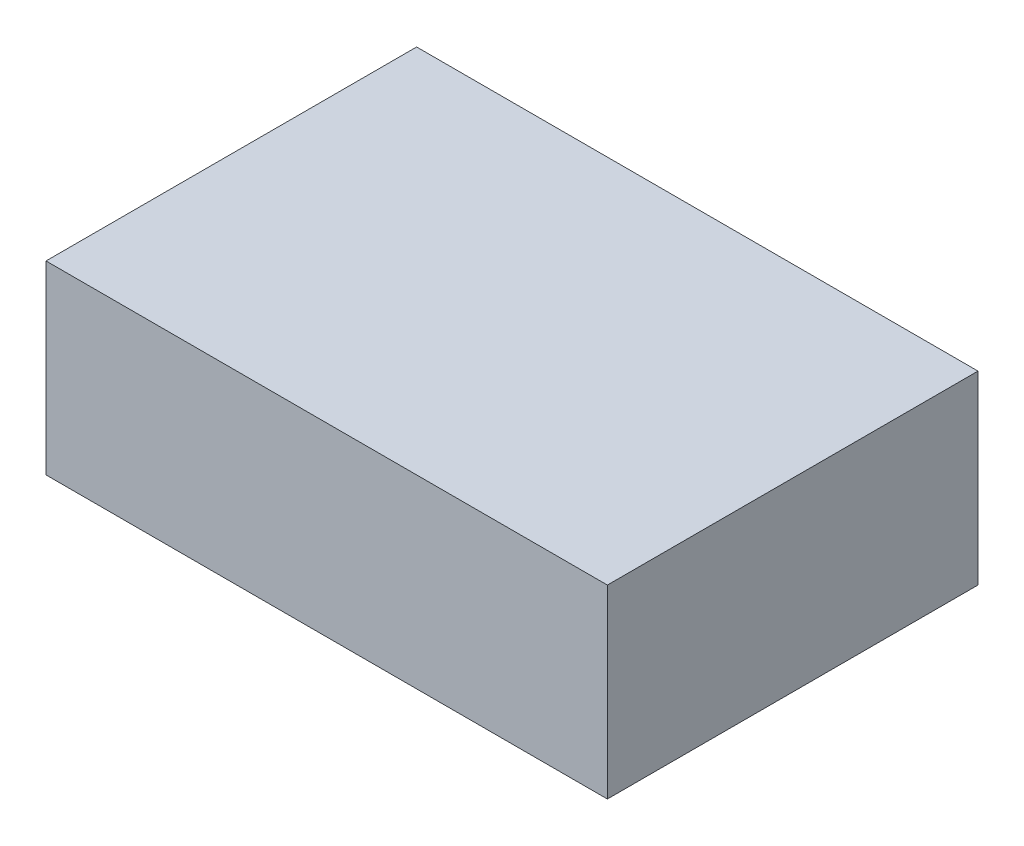
ISO-10303-21;
HEADER;
FILE_DESCRIPTION(('STEP AP214'),'2;1');
FILE_NAME('part.step','',(''),(''),'','','');
FILE_SCHEMA(('AUTOMOTIVE_DESIGN { 1 0 10303 214 1 1 1 1 }'));
ENDSEC;
DATA;
#1=APPLICATION_CONTEXT('core data for automotive mechanical design processes');
#2=APPLICATION_PROTOCOL_DEFINITION('international standard','automotive_design',2000,#1);
#3=PRODUCT_CONTEXT('',#1,'mechanical');
#4=PRODUCT('Part','Part','',(#3));
#5=PRODUCT_RELATED_PRODUCT_CATEGORY('part','',(#4));
#6=PRODUCT_DEFINITION_FORMATION('','',#4);
#7=PRODUCT_DEFINITION_CONTEXT('part definition',#1,'design');
#8=PRODUCT_DEFINITION('design','',#6,#7);
#9=PRODUCT_DEFINITION_SHAPE('','',#8);
#10=(LENGTH_UNIT() NAMED_UNIT(*) SI_UNIT(.MILLI.,.METRE.));
#11=(NAMED_UNIT(*) PLANE_ANGLE_UNIT() SI_UNIT($,.RADIAN.));
#12=(NAMED_UNIT(*) SI_UNIT($,.STERADIAN.) SOLID_ANGLE_UNIT());
#13=UNCERTAINTY_MEASURE_WITH_UNIT(LENGTH_MEASURE(1.E-05),#10,'distance_accuracy_value','');
#14=(GEOMETRIC_REPRESENTATION_CONTEXT(3) GLOBAL_UNCERTAINTY_ASSIGNED_CONTEXT((#13)) GLOBAL_UNIT_ASSIGNED_CONTEXT((#10,
#11,#12)) REPRESENTATION_CONTEXT('',''));
#15=CARTESIAN_POINT('',(0.,0.,0.));
#16=DIRECTION('',(0.,0.,1.));
#17=DIRECTION('',(1.,0.,0.));
#18=AXIS2_PLACEMENT_3D('',#15,#16,#17);
#19=CARTESIAN_POINT('',(0.,86.36,0.));
#20=DIRECTION('',(-1.,0.,0.));
#21=DIRECTION('',(0.,0.,1.));
#22=AXIS2_PLACEMENT_3D('',#19,#20,#21);
#23=PLANE('',#22);
#24=DIRECTION('',(0.,0.,-1.));
#25=VECTOR('',#24,1.);
#26=CARTESIAN_POINT('',(0.,0.,0.));
#27=LINE('',#26,#25);
#28=CARTESIAN_POINT('',(0.,0.,0.));
#29=VERTEX_POINT('',#28);
#30=CARTESIAN_POINT('',(0.,0.,-172.72));
#31=VERTEX_POINT('',#30);
#32=EDGE_CURVE('E110',#29,#31,#27,.T.);
#33=ORIENTED_EDGE('',*,*,#32,.F.);
#34=DIRECTION('',(0.,-1.,0.));
#35=VECTOR('',#34,1.);
#36=CARTESIAN_POINT('',(0.,86.36,0.));
#37=LINE('',#36,#35);
#38=CARTESIAN_POINT('',(0.,86.36,0.));
#39=VERTEX_POINT('',#38);
#40=EDGE_CURVE('E11',#39,#29,#37,.T.);
#41=ORIENTED_EDGE('',*,*,#40,.F.);
#42=DIRECTION('',(0.,0.,-1.));
#43=VECTOR('',#42,1.);
#44=CARTESIAN_POINT('',(0.,86.36,0.));
#45=LINE('',#44,#43);
#46=CARTESIAN_POINT('',(0.,86.36,-172.72));
#47=VERTEX_POINT('',#46);
#48=EDGE_CURVE('E103',#39,#47,#45,.T.);
#49=ORIENTED_EDGE('',*,*,#48,.T.);
#50=DIRECTION('',(0.,-1.,0.));
#51=VECTOR('',#50,1.);
#52=CARTESIAN_POINT('',(0.,86.36,-172.72));
#53=LINE('',#52,#51);
#54=EDGE_CURVE('E42',#47,#31,#53,.T.);
#55=ORIENTED_EDGE('',*,*,#54,.T.);
#56=EDGE_LOOP('',(#33,#41,#49,#55));
#57=FACE_BOUND('',#56,.T.);
#58=ADVANCED_FACE('F39',(#57),#23,.T.);
#59=CARTESIAN_POINT('',(0.,86.36,0.));
#60=DIRECTION('',(0.,0.,-1.));
#61=DIRECTION('',(-1.,0.,0.));
#62=AXIS2_PLACEMENT_3D('',#59,#60,#61);
#63=PLANE('',#62);
#64=DIRECTION('',(1.,0.,0.));
#65=VECTOR('',#64,1.);
#66=CARTESIAN_POINT('',(0.,0.,0.));
#67=LINE('',#66,#65);
#68=CARTESIAN_POINT('',(261.62,0.,0.));
#69=VERTEX_POINT('',#68);
#70=EDGE_CURVE('E73',#29,#69,#67,.T.);
#71=ORIENTED_EDGE('',*,*,#70,.T.);
#72=DIRECTION('',(0.,-1.,0.));
#73=VECTOR('',#72,1.);
#74=CARTESIAN_POINT('',(261.62,86.36,0.));
#75=LINE('',#74,#73);
#76=CARTESIAN_POINT('',(261.62,86.36,0.));
#77=VERTEX_POINT('',#76);
#78=EDGE_CURVE('E49',#77,#69,#75,.T.);
#79=ORIENTED_EDGE('',*,*,#78,.F.);
#80=DIRECTION('',(1.,0.,0.));
#81=VECTOR('',#80,1.);
#82=CARTESIAN_POINT('',(0.,86.36,0.));
#83=LINE('',#82,#81);
#84=EDGE_CURVE('E90',#39,#77,#83,.T.);
#85=ORIENTED_EDGE('',*,*,#84,.F.);
#86=ORIENTED_EDGE('',*,*,#40,.T.);
#87=EDGE_LOOP('',(#71,#79,#85,#86));
#88=FACE_BOUND('',#87,.T.);
#89=ADVANCED_FACE('F126',(#88),#63,.F.);
#90=CARTESIAN_POINT('',(261.62,86.36,0.));
#91=DIRECTION('',(-1.,0.,0.));
#92=DIRECTION('',(0.,0.,1.));
#93=AXIS2_PLACEMENT_3D('',#90,#91,#92);
#94=PLANE('',#93);
#95=DIRECTION('',(0.,0.,-1.));
#96=VECTOR('',#95,1.);
#97=CARTESIAN_POINT('',(261.62,0.,0.));
#98=LINE('',#97,#96);
#99=CARTESIAN_POINT('',(261.62,0.,-172.72));
#100=VERTEX_POINT('',#99);
#101=EDGE_CURVE('E98',#69,#100,#98,.T.);
#102=ORIENTED_EDGE('',*,*,#101,.T.);
#103=DIRECTION('',(0.,-1.,0.));
#104=VECTOR('',#103,1.);
#105=CARTESIAN_POINT('',(261.62,86.36,-172.72));
#106=LINE('',#105,#104);
#107=CARTESIAN_POINT('',(261.62,86.36,-172.72));
#108=VERTEX_POINT('',#107);
#109=EDGE_CURVE('E95',#108,#100,#106,.T.);
#110=ORIENTED_EDGE('',*,*,#109,.F.);
#111=DIRECTION('',(0.,0.,-1.));
#112=VECTOR('',#111,1.);
#113=CARTESIAN_POINT('',(261.62,86.36,0.));
#114=LINE('',#113,#112);
#115=EDGE_CURVE('E85',#77,#108,#114,.T.);
#116=ORIENTED_EDGE('',*,*,#115,.F.);
#117=ORIENTED_EDGE('',*,*,#78,.T.);
#118=EDGE_LOOP('',(#102,#110,#116,#117));
#119=FACE_BOUND('',#118,.T.);
#120=ADVANCED_FACE('F96',(#119),#94,.F.);
#121=CARTESIAN_POINT('',(0.,86.36,-172.72));
#122=DIRECTION('',(0.,0.,-1.));
#123=DIRECTION('',(-1.,0.,0.));
#124=AXIS2_PLACEMENT_3D('',#121,#122,#123);
#125=PLANE('',#124);
#126=DIRECTION('',(1.,0.,0.));
#127=VECTOR('',#126,1.);
#128=CARTESIAN_POINT('',(0.,0.,-172.72));
#129=LINE('',#128,#127);
#130=EDGE_CURVE('E114',#31,#100,#129,.T.);
#131=ORIENTED_EDGE('',*,*,#130,.F.);
#132=ORIENTED_EDGE('',*,*,#54,.F.);
#133=DIRECTION('',(1.,0.,0.));
#134=VECTOR('',#133,1.);
#135=CARTESIAN_POINT('',(0.,86.36,-172.72));
#136=LINE('',#135,#134);
#137=EDGE_CURVE('E89',#47,#108,#136,.T.);
#138=ORIENTED_EDGE('',*,*,#137,.T.);
#139=ORIENTED_EDGE('',*,*,#109,.T.);
#140=EDGE_LOOP('',(#131,#132,#138,#139));
#141=FACE_BOUND('',#140,.T.);
#142=ADVANCED_FACE('F101',(#141),#125,.T.);
#143=CARTESIAN_POINT('',(0.,86.36,0.));
#144=DIRECTION('',(0.,-1.,0.));
#145=DIRECTION('',(0.,0.,-1.));
#146=AXIS2_PLACEMENT_3D('',#143,#144,#145);
#147=PLANE('',#146);
#148=ORIENTED_EDGE('',*,*,#48,.F.);
#149=ORIENTED_EDGE('',*,*,#84,.T.);
#150=ORIENTED_EDGE('',*,*,#115,.T.);
#151=ORIENTED_EDGE('',*,*,#137,.F.);
#152=EDGE_LOOP('',(#148,#149,#150,#151));
#153=FACE_BOUND('',#152,.T.);
#154=ADVANCED_FACE('F88',(#153),#147,.F.);
#155=CARTESIAN_POINT('',(0.,0.,0.));
#156=DIRECTION('',(0.,-1.,0.));
#157=DIRECTION('',(0.,0.,-1.));
#158=AXIS2_PLACEMENT_3D('',#155,#156,#157);
#159=PLANE('',#158);
#160=ORIENTED_EDGE('',*,*,#32,.T.);
#161=ORIENTED_EDGE('',*,*,#130,.T.);
#162=ORIENTED_EDGE('',*,*,#101,.F.);
#163=ORIENTED_EDGE('',*,*,#70,.F.);
#164=EDGE_LOOP('',(#160,#161,#162,#163));
#165=FACE_BOUND('',#164,.T.);
#166=ADVANCED_FACE('F123',(#165),#159,.T.);
#167=CLOSED_SHELL('',(#58,#89,#120,#142,#154,#166));
#168=MANIFOLD_SOLID_BREP('B2',#167);
#169=ADVANCED_BREP_SHAPE_REPRESENTATION('',(#18,#168),#14);
#170=SHAPE_DEFINITION_REPRESENTATION(#9,#169);
ENDSEC;
END-ISO-10303-21;
